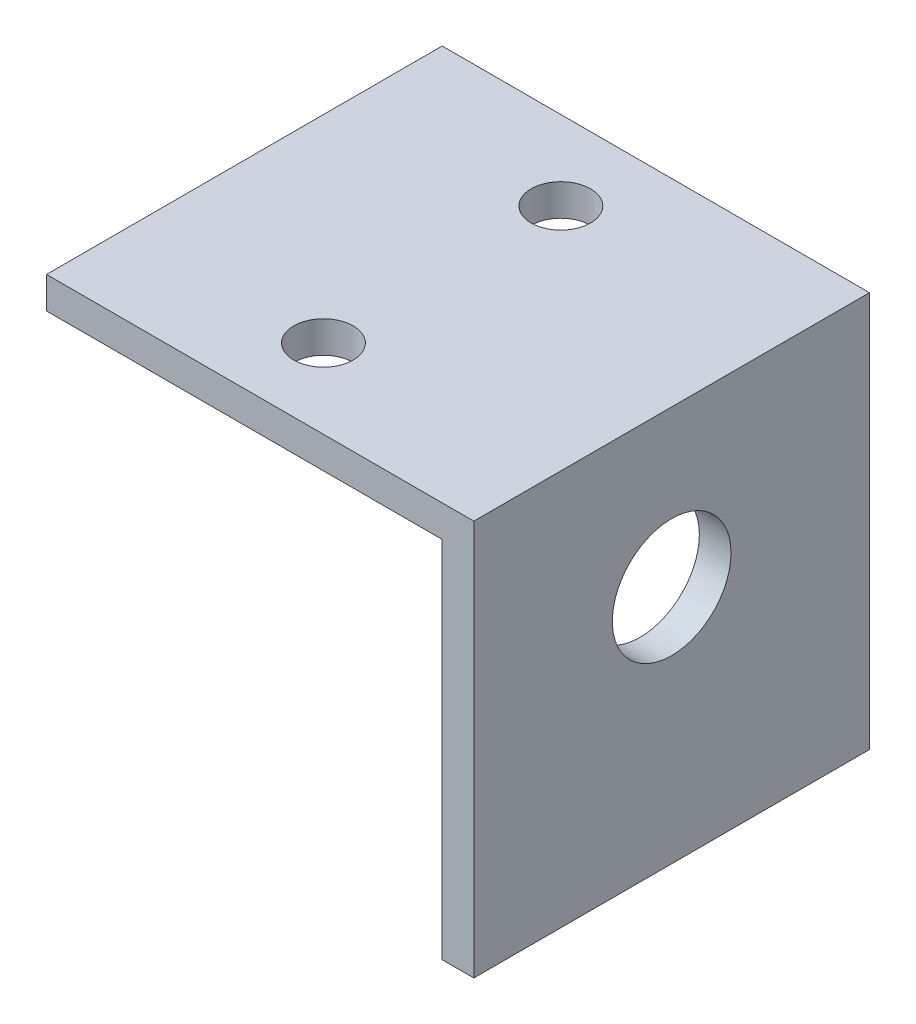
ISO-10303-21;
HEADER;
FILE_DESCRIPTION(('STEP AP214'),'2;1');
FILE_NAME('part.step','',(''),(''),'','','');
FILE_SCHEMA(('AUTOMOTIVE_DESIGN { 1 0 10303 214 1 1 1 1 }'));
ENDSEC;
DATA;
#1=APPLICATION_CONTEXT('core data for automotive mechanical design processes');
#2=APPLICATION_PROTOCOL_DEFINITION('international standard','automotive_design',2000,#1);
#3=PRODUCT_CONTEXT('',#1,'mechanical');
#4=PRODUCT('Part','Part','',(#3));
#5=PRODUCT_RELATED_PRODUCT_CATEGORY('part','',(#4));
#6=PRODUCT_DEFINITION_FORMATION('','',#4);
#7=PRODUCT_DEFINITION_CONTEXT('part definition',#1,'design');
#8=PRODUCT_DEFINITION('design','',#6,#7);
#9=PRODUCT_DEFINITION_SHAPE('','',#8);
#10=(LENGTH_UNIT() NAMED_UNIT(*) SI_UNIT(.MILLI.,.METRE.));
#11=(NAMED_UNIT(*) PLANE_ANGLE_UNIT() SI_UNIT($,.RADIAN.));
#12=(NAMED_UNIT(*) SI_UNIT($,.STERADIAN.) SOLID_ANGLE_UNIT());
#13=UNCERTAINTY_MEASURE_WITH_UNIT(LENGTH_MEASURE(1.E-05),#10,'distance_accuracy_value','');
#14=(GEOMETRIC_REPRESENTATION_CONTEXT(3) GLOBAL_UNCERTAINTY_ASSIGNED_CONTEXT((#13)) GLOBAL_UNIT_ASSIGNED_CONTEXT((#10,
#11,#12)) REPRESENTATION_CONTEXT('',''));
#15=CARTESIAN_POINT('',(0.,0.,0.));
#16=DIRECTION('',(0.,0.,1.));
#17=DIRECTION('',(1.,0.,0.));
#18=AXIS2_PLACEMENT_3D('',#15,#16,#17);
#19=CARTESIAN_POINT('',(0.,-1.6,10.));
#20=DIRECTION('',(0.,0.,1.));
#21=DIRECTION('',(1.,0.,0.));
#22=AXIS2_PLACEMENT_3D('',#19,#20,#21);
#23=PLANE('',#22);
#24=DIRECTION('',(1.,0.,0.));
#25=VECTOR('',#24,1.);
#26=CARTESIAN_POINT('',(0.,0.,10.));
#27=LINE('',#26,#25);
#28=CARTESIAN_POINT('',(-9.99999999999999,0.,10.));
#29=VERTEX_POINT('',#28);
#30=CARTESIAN_POINT('',(11.6,0.,10.));
#31=VERTEX_POINT('',#30);
#32=EDGE_CURVE('E97',#29,#31,#27,.T.);
#33=ORIENTED_EDGE('',*,*,#32,.F.);
#34=DIRECTION('',(0.,1.,0.));
#35=VECTOR('',#34,1.);
#36=CARTESIAN_POINT('',(-9.99999999999999,-1.6,10.));
#37=LINE('',#36,#35);
#38=CARTESIAN_POINT('',(-9.99999999999999,-1.6,10.));
#39=VERTEX_POINT('',#38);
#40=EDGE_CURVE('E11',#39,#29,#37,.T.);
#41=ORIENTED_EDGE('',*,*,#40,.F.);
#42=DIRECTION('',(1.,0.,0.));
#43=VECTOR('',#42,1.);
#44=CARTESIAN_POINT('',(0.,-1.6,10.));
#45=LINE('',#44,#43);
#46=CARTESIAN_POINT('',(10.,-1.6,10.));
#47=VERTEX_POINT('',#46);
#48=EDGE_CURVE('E78',#39,#47,#45,.T.);
#49=ORIENTED_EDGE('',*,*,#48,.T.);
#50=DIRECTION('',(0.,1.,0.));
#51=VECTOR('',#50,1.);
#52=CARTESIAN_POINT('',(10.,-20.,10.));
#53=LINE('',#52,#51);
#54=CARTESIAN_POINT('',(10.,-20.,10.));
#55=VERTEX_POINT('',#54);
#56=EDGE_CURVE('E86',#55,#47,#53,.T.);
#57=ORIENTED_EDGE('',*,*,#56,.F.);
#58=DIRECTION('',(1.,0.,0.));
#59=VECTOR('',#58,1.);
#60=CARTESIAN_POINT('',(0.,-20.,10.));
#61=LINE('',#60,#59);
#62=CARTESIAN_POINT('',(11.6,-20.,10.));
#63=VERTEX_POINT('',#62);
#64=EDGE_CURVE('E104',#55,#63,#61,.T.);
#65=ORIENTED_EDGE('',*,*,#64,.T.);
#66=DIRECTION('',(0.,1.,0.));
#67=VECTOR('',#66,1.);
#68=CARTESIAN_POINT('',(11.6,-20.,10.));
#69=LINE('',#68,#67);
#70=EDGE_CURVE('E93',#63,#31,#69,.T.);
#71=ORIENTED_EDGE('',*,*,#70,.T.);
#72=EDGE_LOOP('',(#33,#41,#49,#57,#65,#71));
#73=FACE_BOUND('',#72,.T.);
#74=ADVANCED_FACE('F33',(#73),#23,.T.);
#75=CARTESIAN_POINT('',(-9.99999999999999,-1.6,0.));
#76=DIRECTION('',(1.,0.,0.));
#77=DIRECTION('',(0.,0.,-1.));
#78=AXIS2_PLACEMENT_3D('',#75,#76,#77);
#79=PLANE('',#78);
#80=DIRECTION('',(0.,0.,-1.));
#81=VECTOR('',#80,1.);
#82=CARTESIAN_POINT('',(-9.99999999999999,0.,0.));
#83=LINE('',#82,#81);
#84=CARTESIAN_POINT('',(-9.99999999999999,0.,-10.));
#85=VERTEX_POINT('',#84);
#86=EDGE_CURVE('E59',#29,#85,#83,.T.);
#87=ORIENTED_EDGE('',*,*,#86,.T.);
#88=DIRECTION('',(0.,1.,0.));
#89=VECTOR('',#88,1.);
#90=CARTESIAN_POINT('',(-9.99999999999999,-1.6,-10.));
#91=LINE('',#90,#89);
#92=CARTESIAN_POINT('',(-9.99999999999999,-1.6,-10.));
#93=VERTEX_POINT('',#92);
#94=EDGE_CURVE('E36',#93,#85,#91,.T.);
#95=ORIENTED_EDGE('',*,*,#94,.F.);
#96=DIRECTION('',(0.,0.,-1.));
#97=VECTOR('',#96,1.);
#98=CARTESIAN_POINT('',(-9.99999999999999,-1.6,0.));
#99=LINE('',#98,#97);
#100=EDGE_CURVE('E107',#39,#93,#99,.T.);
#101=ORIENTED_EDGE('',*,*,#100,.F.);
#102=ORIENTED_EDGE('',*,*,#40,.T.);
#103=EDGE_LOOP('',(#87,#95,#101,#102));
#104=FACE_BOUND('',#103,.T.);
#105=ADVANCED_FACE('F178',(#104),#79,.F.);
#106=CARTESIAN_POINT('',(0.,-1.6,-10.));
#107=DIRECTION('',(0.,0.,1.));
#108=DIRECTION('',(1.,0.,0.));
#109=AXIS2_PLACEMENT_3D('',#106,#107,#108);
#110=PLANE('',#109);
#111=DIRECTION('',(1.,0.,0.));
#112=VECTOR('',#111,1.);
#113=CARTESIAN_POINT('',(0.,0.,-10.));
#114=LINE('',#113,#112);
#115=CARTESIAN_POINT('',(11.6,0.,-10.));
#116=VERTEX_POINT('',#115);
#117=EDGE_CURVE('E111',#85,#116,#114,.T.);
#118=ORIENTED_EDGE('',*,*,#117,.T.);
#119=DIRECTION('',(0.,1.,0.));
#120=VECTOR('',#119,1.);
#121=CARTESIAN_POINT('',(11.6,-20.,-10.));
#122=LINE('',#121,#120);
#123=CARTESIAN_POINT('',(11.6,-20.,-10.));
#124=VERTEX_POINT('',#123);
#125=EDGE_CURVE('E99',#124,#116,#122,.T.);
#126=ORIENTED_EDGE('',*,*,#125,.F.);
#127=DIRECTION('',(1.,0.,0.));
#128=VECTOR('',#127,1.);
#129=CARTESIAN_POINT('',(0.,-20.,-10.));
#130=LINE('',#129,#128);
#131=CARTESIAN_POINT('',(10.,-20.,-10.));
#132=VERTEX_POINT('',#131);
#133=EDGE_CURVE('E132',#132,#124,#130,.T.);
#134=ORIENTED_EDGE('',*,*,#133,.F.);
#135=DIRECTION('',(0.,1.,0.));
#136=VECTOR('',#135,1.);
#137=CARTESIAN_POINT('',(10.,-20.,-10.));
#138=LINE('',#137,#136);
#139=CARTESIAN_POINT('',(10.,-1.6,-10.));
#140=VERTEX_POINT('',#139);
#141=EDGE_CURVE('E94',#132,#140,#138,.T.);
#142=ORIENTED_EDGE('',*,*,#141,.T.);
#143=DIRECTION('',(1.,0.,0.));
#144=VECTOR('',#143,1.);
#145=CARTESIAN_POINT('',(0.,-1.6,-10.));
#146=LINE('',#145,#144);
#147=EDGE_CURVE('E67',#93,#140,#146,.T.);
#148=ORIENTED_EDGE('',*,*,#147,.F.);
#149=ORIENTED_EDGE('',*,*,#94,.T.);
#150=EDGE_LOOP('',(#118,#126,#134,#142,#148,#149));
#151=FACE_BOUND('',#150,.T.);
#152=ADVANCED_FACE('F118',(#151),#110,.F.);
#153=CARTESIAN_POINT('',(0.,-1.6,0.));
#154=DIRECTION('',(0.,1.,0.));
#155=DIRECTION('',(0.,0.,1.));
#156=AXIS2_PLACEMENT_3D('',#153,#154,#155);
#157=PLANE('',#156);
#158=CARTESIAN_POINT('',(0.,-1.6,-6.));
#159=DIRECTION('',(0.,1.,0.));
#160=DIRECTION('',(0.,0.,1.));
#161=AXIS2_PLACEMENT_3D('',#158,#159,#160);
#162=CIRCLE('',#161,1.5);
#163=CARTESIAN_POINT('',(0.,-1.6,-4.5));
#164=VERTEX_POINT('',#163);
#165=EDGE_CURVE('E144',#164,#164,#162,.T.);
#166=ORIENTED_EDGE('',*,*,#165,.T.);
#167=EDGE_LOOP('',(#166));
#168=FACE_BOUND('',#167,.T.);
#169=CARTESIAN_POINT('',(0.,-1.6,6.));
#170=DIRECTION('',(0.,1.,0.));
#171=DIRECTION('',(0.,0.,1.));
#172=AXIS2_PLACEMENT_3D('',#169,#170,#171);
#173=CIRCLE('',#172,1.5);
#174=CARTESIAN_POINT('',(0.,-1.6,7.5));
#175=VERTEX_POINT('',#174);
#176=EDGE_CURVE('E147',#175,#175,#173,.T.);
#177=ORIENTED_EDGE('',*,*,#176,.T.);
#178=EDGE_LOOP('',(#177));
#179=FACE_BOUND('',#178,.T.);
#180=ORIENTED_EDGE('',*,*,#48,.F.);
#181=ORIENTED_EDGE('',*,*,#100,.T.);
#182=ORIENTED_EDGE('',*,*,#147,.T.);
#183=DIRECTION('',(0.,0.,-1.));
#184=VECTOR('',#183,1.);
#185=CARTESIAN_POINT('',(10.,-1.6,0.));
#186=LINE('',#185,#184);
#187=EDGE_CURVE('E76',#47,#140,#186,.T.);
#188=ORIENTED_EDGE('',*,*,#187,.F.);
#189=EDGE_LOOP('',(#180,#181,#182,#188));
#190=FACE_BOUND('',#189,.T.);
#191=ADVANCED_FACE('F77',(#168,#179,#190),#157,.F.);
#192=CARTESIAN_POINT('',(0.,0.,0.));
#193=DIRECTION('',(0.,1.,0.));
#194=DIRECTION('',(0.,0.,1.));
#195=AXIS2_PLACEMENT_3D('',#192,#193,#194);
#196=PLANE('',#195);
#197=CARTESIAN_POINT('',(0.,0.,-6.));
#198=DIRECTION('',(0.,1.,0.));
#199=DIRECTION('',(0.,0.,1.));
#200=AXIS2_PLACEMENT_3D('',#197,#198,#199);
#201=CIRCLE('',#200,1.5);
#202=CARTESIAN_POINT('',(0.,0.,-4.5));
#203=VERTEX_POINT('',#202);
#204=EDGE_CURVE('E150',#203,#203,#201,.T.);
#205=ORIENTED_EDGE('',*,*,#204,.F.);
#206=EDGE_LOOP('',(#205));
#207=FACE_BOUND('',#206,.T.);
#208=CARTESIAN_POINT('',(0.,0.,6.));
#209=DIRECTION('',(0.,1.,0.));
#210=DIRECTION('',(0.,0.,1.));
#211=AXIS2_PLACEMENT_3D('',#208,#209,#210);
#212=CIRCLE('',#211,1.5);
#213=CARTESIAN_POINT('',(0.,0.,7.5));
#214=VERTEX_POINT('',#213);
#215=EDGE_CURVE('E151',#214,#214,#212,.T.);
#216=ORIENTED_EDGE('',*,*,#215,.F.);
#217=EDGE_LOOP('',(#216));
#218=FACE_BOUND('',#217,.T.);
#219=ORIENTED_EDGE('',*,*,#32,.T.);
#220=DIRECTION('',(0.,0.,1.));
#221=VECTOR('',#220,1.);
#222=CARTESIAN_POINT('',(11.6,0.,0.));
#223=LINE('',#222,#221);
#224=EDGE_CURVE('E128',#116,#31,#223,.T.);
#225=ORIENTED_EDGE('',*,*,#224,.F.);
#226=ORIENTED_EDGE('',*,*,#117,.F.);
#227=ORIENTED_EDGE('',*,*,#86,.F.);
#228=EDGE_LOOP('',(#219,#225,#226,#227));
#229=FACE_BOUND('',#228,.T.);
#230=ADVANCED_FACE('F130',(#207,#218,#229),#196,.T.);
#231=CARTESIAN_POINT('',(10.,-20.,0.));
#232=DIRECTION('',(1.,0.,0.));
#233=DIRECTION('',(0.,0.,-1.));
#234=AXIS2_PLACEMENT_3D('',#231,#232,#233);
#235=PLANE('',#234);
#236=CARTESIAN_POINT('',(10.,-7.88867758065414,0.));
#237=DIRECTION('',(1.,0.,0.));
#238=DIRECTION('',(0.,0.,-1.));
#239=AXIS2_PLACEMENT_3D('',#236,#237,#238);
#240=CIRCLE('',#239,3.);
#241=CARTESIAN_POINT('',(10.,-7.88867758065414,-3.));
#242=VERTEX_POINT('',#241);
#243=EDGE_CURVE('E131',#242,#242,#240,.T.);
#244=ORIENTED_EDGE('',*,*,#243,.T.);
#245=EDGE_LOOP('',(#244));
#246=FACE_BOUND('',#245,.T.);
#247=ORIENTED_EDGE('',*,*,#56,.T.);
#248=ORIENTED_EDGE('',*,*,#187,.T.);
#249=ORIENTED_EDGE('',*,*,#141,.F.);
#250=DIRECTION('',(0.,0.,-1.));
#251=VECTOR('',#250,1.);
#252=CARTESIAN_POINT('',(10.,-20.,0.));
#253=LINE('',#252,#251);
#254=EDGE_CURVE('E91',#55,#132,#253,.T.);
#255=ORIENTED_EDGE('',*,*,#254,.F.);
#256=EDGE_LOOP('',(#247,#248,#249,#255));
#257=FACE_BOUND('',#256,.T.);
#258=ADVANCED_FACE('F89',(#246,#257),#235,.F.);
#259=CARTESIAN_POINT('',(11.6,-20.,0.));
#260=DIRECTION('',(-1.,0.,0.));
#261=DIRECTION('',(0.,0.,1.));
#262=AXIS2_PLACEMENT_3D('',#259,#260,#261);
#263=PLANE('',#262);
#264=CARTESIAN_POINT('',(11.6,-7.88867758065414,0.));
#265=DIRECTION('',(1.,0.,0.));
#266=DIRECTION('',(0.,0.,-1.));
#267=AXIS2_PLACEMENT_3D('',#264,#265,#266);
#268=CIRCLE('',#267,3.);
#269=CARTESIAN_POINT('',(11.6,-7.88867758065414,-3.));
#270=VERTEX_POINT('',#269);
#271=EDGE_CURVE('E135',#270,#270,#268,.T.);
#272=ORIENTED_EDGE('',*,*,#271,.F.);
#273=EDGE_LOOP('',(#272));
#274=FACE_BOUND('',#273,.T.);
#275=ORIENTED_EDGE('',*,*,#224,.T.);
#276=ORIENTED_EDGE('',*,*,#70,.F.);
#277=DIRECTION('',(0.,0.,1.));
#278=VECTOR('',#277,1.);
#279=CARTESIAN_POINT('',(11.6,-20.,0.));
#280=LINE('',#279,#278);
#281=EDGE_CURVE('E129',#124,#63,#280,.T.);
#282=ORIENTED_EDGE('',*,*,#281,.F.);
#283=ORIENTED_EDGE('',*,*,#125,.T.);
#284=EDGE_LOOP('',(#275,#276,#282,#283));
#285=FACE_BOUND('',#284,.T.);
#286=ADVANCED_FACE('F126',(#274,#285),#263,.F.);
#287=CARTESIAN_POINT('',(0.,-20.,0.));
#288=DIRECTION('',(0.,1.,0.));
#289=DIRECTION('',(0.,0.,1.));
#290=AXIS2_PLACEMENT_3D('',#287,#288,#289);
#291=PLANE('',#290);
#292=ORIENTED_EDGE('',*,*,#281,.T.);
#293=ORIENTED_EDGE('',*,*,#64,.F.);
#294=ORIENTED_EDGE('',*,*,#254,.T.);
#295=ORIENTED_EDGE('',*,*,#133,.T.);
#296=EDGE_LOOP('',(#292,#293,#294,#295));
#297=FACE_BOUND('',#296,.T.);
#298=ADVANCED_FACE('F200',(#297),#291,.F.);
#299=CARTESIAN_POINT('',(8.6,-7.88867758065414,0.));
#300=DIRECTION('',(1.,0.,0.));
#301=DIRECTION('',(0.,0.,-1.));
#302=AXIS2_PLACEMENT_3D('',#299,#300,#301);
#303=CYLINDRICAL_SURFACE('',#302,3.);
#304=ORIENTED_EDGE('',*,*,#271,.T.);
#305=EDGE_LOOP('',(#304));
#306=FACE_BOUND('',#305,.T.);
#307=ORIENTED_EDGE('',*,*,#243,.F.);
#308=EDGE_LOOP('',(#307));
#309=FACE_BOUND('',#308,.T.);
#310=ADVANCED_FACE('F168',(#306,#309),#303,.F.);
#311=CARTESIAN_POINT('',(0.,-2.,6.));
#312=DIRECTION('',(0.,1.,0.));
#313=DIRECTION('',(0.,0.,1.));
#314=AXIS2_PLACEMENT_3D('',#311,#312,#313);
#315=CYLINDRICAL_SURFACE('',#314,1.5);
#316=ORIENTED_EDGE('',*,*,#215,.T.);
#317=EDGE_LOOP('',(#316));
#318=FACE_BOUND('',#317,.T.);
#319=ORIENTED_EDGE('',*,*,#176,.F.);
#320=EDGE_LOOP('',(#319));
#321=FACE_BOUND('',#320,.T.);
#322=ADVANCED_FACE('F165',(#318,#321),#315,.F.);
#323=CARTESIAN_POINT('',(0.,-2.,-6.));
#324=DIRECTION('',(0.,1.,0.));
#325=DIRECTION('',(0.,0.,1.));
#326=AXIS2_PLACEMENT_3D('',#323,#324,#325);
#327=CYLINDRICAL_SURFACE('',#326,1.5);
#328=ORIENTED_EDGE('',*,*,#204,.T.);
#329=EDGE_LOOP('',(#328));
#330=FACE_BOUND('',#329,.T.);
#331=ORIENTED_EDGE('',*,*,#165,.F.);
#332=EDGE_LOOP('',(#331));
#333=FACE_BOUND('',#332,.T.);
#334=ADVANCED_FACE('F157',(#330,#333),#327,.F.);
#335=CLOSED_SHELL('',(#74,#105,#152,#191,#230,#258,#286,#298,#310,#322,#334));
#336=MANIFOLD_SOLID_BREP('B2',#335);
#337=ADVANCED_BREP_SHAPE_REPRESENTATION('',(#18,#336),#14);
#338=SHAPE_DEFINITION_REPRESENTATION(#9,#337);
ENDSEC;
END-ISO-10303-21;
